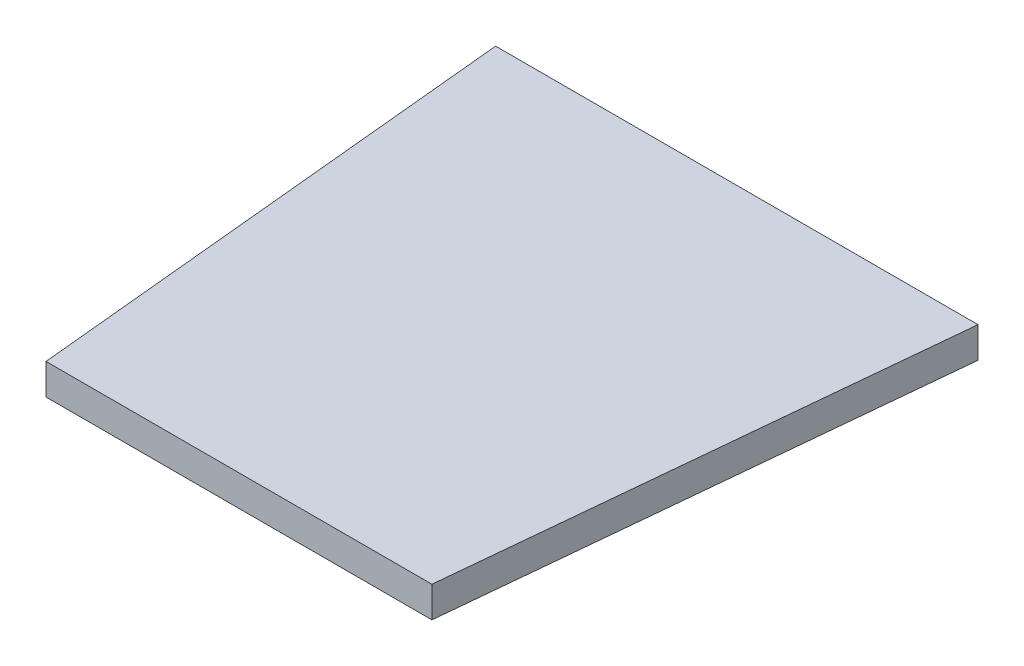
ISO-10303-21;
HEADER;
FILE_DESCRIPTION(('STEP AP214'),'2;1');
FILE_NAME('part.step','',(''),(''),'','','');
FILE_SCHEMA(('AUTOMOTIVE_DESIGN { 1 0 10303 214 1 1 1 1 }'));
ENDSEC;
DATA;
#1=APPLICATION_CONTEXT('core data for automotive mechanical design processes');
#2=APPLICATION_PROTOCOL_DEFINITION('international standard','automotive_design',2000,#1);
#3=PRODUCT_CONTEXT('',#1,'mechanical');
#4=PRODUCT('Part','Part','',(#3));
#5=PRODUCT_RELATED_PRODUCT_CATEGORY('part','',(#4));
#6=PRODUCT_DEFINITION_FORMATION('','',#4);
#7=PRODUCT_DEFINITION_CONTEXT('part definition',#1,'design');
#8=PRODUCT_DEFINITION('design','',#6,#7);
#9=PRODUCT_DEFINITION_SHAPE('','',#8);
#10=(LENGTH_UNIT() NAMED_UNIT(*) SI_UNIT(.MILLI.,.METRE.));
#11=(NAMED_UNIT(*) PLANE_ANGLE_UNIT() SI_UNIT($,.RADIAN.));
#12=(NAMED_UNIT(*) SI_UNIT($,.STERADIAN.) SOLID_ANGLE_UNIT());
#13=UNCERTAINTY_MEASURE_WITH_UNIT(LENGTH_MEASURE(1.E-05),#10,'distance_accuracy_value','');
#14=(GEOMETRIC_REPRESENTATION_CONTEXT(3) GLOBAL_UNCERTAINTY_ASSIGNED_CONTEXT((#13)) GLOBAL_UNIT_ASSIGNED_CONTEXT((#10,
#11,#12)) REPRESENTATION_CONTEXT('',''));
#15=CARTESIAN_POINT('',(0.,0.,0.));
#16=DIRECTION('',(0.,0.,1.));
#17=DIRECTION('',(1.,0.,0.));
#18=AXIS2_PLACEMENT_3D('',#15,#16,#17);
#19=CARTESIAN_POINT('',(-10.,1.6,11.9702127659574));
#20=DIRECTION('',(0.995338074271147,0.,-0.0964474878169716));
#21=DIRECTION('',(-0.0964474878169716,0.,-0.995338074271147));
#22=AXIS2_PLACEMENT_3D('',#19,#20,#21);
#23=PLANE('',#22);
#24=DIRECTION('',(0.0964474878169716,0.,0.995338074271147));
#25=VECTOR('',#24,1.);
#26=CARTESIAN_POINT('',(-10.,0.,11.9702127659574));
#27=LINE('',#26,#25);
#28=CARTESIAN_POINT('',(-12.5,0.,-13.8297872340426));
#29=VERTEX_POINT('',#28);
#30=CARTESIAN_POINT('',(-10.,0.,11.9702127659574));
#31=VERTEX_POINT('',#30);
#32=EDGE_CURVE('E98',#29,#31,#27,.T.);
#33=ORIENTED_EDGE('',*,*,#32,.T.);
#34=DIRECTION('',(0.,-1.,0.));
#35=VECTOR('',#34,1.);
#36=CARTESIAN_POINT('',(-10.,1.6,11.9702127659574));
#37=LINE('',#36,#35);
#38=CARTESIAN_POINT('',(-10.,1.6,11.9702127659574));
#39=VERTEX_POINT('',#38);
#40=EDGE_CURVE('E11',#39,#31,#37,.T.);
#41=ORIENTED_EDGE('',*,*,#40,.F.);
#42=DIRECTION('',(0.0964474878169716,0.,0.995338074271147));
#43=VECTOR('',#42,1.);
#44=CARTESIAN_POINT('',(-10.,1.6,11.9702127659574));
#45=LINE('',#44,#43);
#46=CARTESIAN_POINT('',(-12.5,1.6,-13.8297872340426));
#47=VERTEX_POINT('',#46);
#48=EDGE_CURVE('E86',#47,#39,#45,.T.);
#49=ORIENTED_EDGE('',*,*,#48,.F.);
#50=DIRECTION('',(0.,-1.,0.));
#51=VECTOR('',#50,1.);
#52=CARTESIAN_POINT('',(-12.5,1.6,-13.8297872340426));
#53=LINE('',#52,#51);
#54=EDGE_CURVE('E94',#47,#29,#53,.T.);
#55=ORIENTED_EDGE('',*,*,#54,.T.);
#56=EDGE_LOOP('',(#33,#41,#49,#55));
#57=FACE_BOUND('',#56,.T.);
#58=ADVANCED_FACE('F35',(#57),#23,.F.);
#59=CARTESIAN_POINT('',(10.,1.6,11.9702127659574));
#60=DIRECTION('',(0.,0.,-1.));
#61=DIRECTION('',(-1.,0.,0.));
#62=AXIS2_PLACEMENT_3D('',#59,#60,#61);
#63=PLANE('',#62);
#64=DIRECTION('',(1.,0.,0.));
#65=VECTOR('',#64,1.);
#66=CARTESIAN_POINT('',(10.,0.,11.9702127659574));
#67=LINE('',#66,#65);
#68=CARTESIAN_POINT('',(10.,0.,11.9702127659574));
#69=VERTEX_POINT('',#68);
#70=EDGE_CURVE('E90',#31,#69,#67,.T.);
#71=ORIENTED_EDGE('',*,*,#70,.T.);
#72=DIRECTION('',(0.,-1.,0.));
#73=VECTOR('',#72,1.);
#74=CARTESIAN_POINT('',(10.,1.6,11.9702127659574));
#75=LINE('',#74,#73);
#76=CARTESIAN_POINT('',(10.,1.6,11.9702127659574));
#77=VERTEX_POINT('',#76);
#78=EDGE_CURVE('E43',#77,#69,#75,.T.);
#79=ORIENTED_EDGE('',*,*,#78,.F.);
#80=DIRECTION('',(1.,0.,0.));
#81=VECTOR('',#80,1.);
#82=CARTESIAN_POINT('',(10.,1.6,11.9702127659574));
#83=LINE('',#82,#81);
#84=EDGE_CURVE('E81',#39,#77,#83,.T.);
#85=ORIENTED_EDGE('',*,*,#84,.F.);
#86=ORIENTED_EDGE('',*,*,#40,.T.);
#87=EDGE_LOOP('',(#71,#79,#85,#86));
#88=FACE_BOUND('',#87,.T.);
#89=ADVANCED_FACE('F89',(#88),#63,.F.);
#90=CARTESIAN_POINT('',(10.,1.6,11.9702127659574));
#91=DIRECTION('',(-0.995338074271147,0.,-0.0964474878169716));
#92=DIRECTION('',(-0.0964474878169716,0.,0.995338074271147));
#93=AXIS2_PLACEMENT_3D('',#90,#91,#92);
#94=PLANE('',#93);
#95=DIRECTION('',(0.0964474878169716,0.,-0.995338074271147));
#96=VECTOR('',#95,1.);
#97=CARTESIAN_POINT('',(10.,0.,11.9702127659574));
#98=LINE('',#97,#96);
#99=CARTESIAN_POINT('',(12.5,0.,-13.8297872340426));
#100=VERTEX_POINT('',#99);
#101=EDGE_CURVE('E68',#69,#100,#98,.T.);
#102=ORIENTED_EDGE('',*,*,#101,.T.);
#103=DIRECTION('',(0.,-1.,0.));
#104=VECTOR('',#103,1.);
#105=CARTESIAN_POINT('',(12.5,1.6,-13.8297872340426));
#106=LINE('',#105,#104);
#107=CARTESIAN_POINT('',(12.5,1.6,-13.8297872340426));
#108=VERTEX_POINT('',#107);
#109=EDGE_CURVE('E91',#108,#100,#106,.T.);
#110=ORIENTED_EDGE('',*,*,#109,.F.);
#111=DIRECTION('',(0.0964474878169716,0.,-0.995338074271147));
#112=VECTOR('',#111,1.);
#113=CARTESIAN_POINT('',(10.,1.6,11.9702127659574));
#114=LINE('',#113,#112);
#115=EDGE_CURVE('E84',#77,#108,#114,.T.);
#116=ORIENTED_EDGE('',*,*,#115,.F.);
#117=ORIENTED_EDGE('',*,*,#78,.T.);
#118=EDGE_LOOP('',(#102,#110,#116,#117));
#119=FACE_BOUND('',#118,.T.);
#120=ADVANCED_FACE('F92',(#119),#94,.F.);
#121=CARTESIAN_POINT('',(-12.5,1.6,-13.8297872340426));
#122=DIRECTION('',(0.,0.,1.));
#123=DIRECTION('',(1.,0.,0.));
#124=AXIS2_PLACEMENT_3D('',#121,#122,#123);
#125=PLANE('',#124);
#126=DIRECTION('',(-1.,0.,0.));
#127=VECTOR('',#126,1.);
#128=CARTESIAN_POINT('',(-12.5,0.,-13.8297872340426));
#129=LINE('',#128,#127);
#130=EDGE_CURVE('E74',#100,#29,#129,.T.);
#131=ORIENTED_EDGE('',*,*,#130,.T.);
#132=ORIENTED_EDGE('',*,*,#54,.F.);
#133=DIRECTION('',(-1.,0.,0.));
#134=VECTOR('',#133,1.);
#135=CARTESIAN_POINT('',(-12.5,1.6,-13.8297872340426));
#136=LINE('',#135,#134);
#137=EDGE_CURVE('E51',#108,#47,#136,.T.);
#138=ORIENTED_EDGE('',*,*,#137,.F.);
#139=ORIENTED_EDGE('',*,*,#109,.T.);
#140=EDGE_LOOP('',(#131,#132,#138,#139));
#141=FACE_BOUND('',#140,.T.);
#142=ADVANCED_FACE('F105',(#141),#125,.F.);
#143=CARTESIAN_POINT('',(0.,1.6,0.));
#144=DIRECTION('',(0.,-1.,0.));
#145=DIRECTION('',(0.,0.,-1.));
#146=AXIS2_PLACEMENT_3D('',#143,#144,#145);
#147=PLANE('',#146);
#148=ORIENTED_EDGE('',*,*,#48,.T.);
#149=ORIENTED_EDGE('',*,*,#84,.T.);
#150=ORIENTED_EDGE('',*,*,#115,.T.);
#151=ORIENTED_EDGE('',*,*,#137,.T.);
#152=EDGE_LOOP('',(#148,#149,#150,#151));
#153=FACE_BOUND('',#152,.T.);
#154=ADVANCED_FACE('F82',(#153),#147,.F.);
#155=CARTESIAN_POINT('',(0.,0.,0.));
#156=DIRECTION('',(0.,-1.,0.));
#157=DIRECTION('',(0.,0.,-1.));
#158=AXIS2_PLACEMENT_3D('',#155,#156,#157);
#159=PLANE('',#158);
#160=ORIENTED_EDGE('',*,*,#32,.F.);
#161=ORIENTED_EDGE('',*,*,#130,.F.);
#162=ORIENTED_EDGE('',*,*,#101,.F.);
#163=ORIENTED_EDGE('',*,*,#70,.F.);
#164=EDGE_LOOP('',(#160,#161,#162,#163));
#165=FACE_BOUND('',#164,.T.);
#166=ADVANCED_FACE('F108',(#165),#159,.T.);
#167=CLOSED_SHELL('',(#58,#89,#120,#142,#154,#166));
#168=MANIFOLD_SOLID_BREP('B2',#167);
#169=ADVANCED_BREP_SHAPE_REPRESENTATION('',(#18,#168),#14);
#170=SHAPE_DEFINITION_REPRESENTATION(#9,#169);
ENDSEC;
END-ISO-10303-21;
